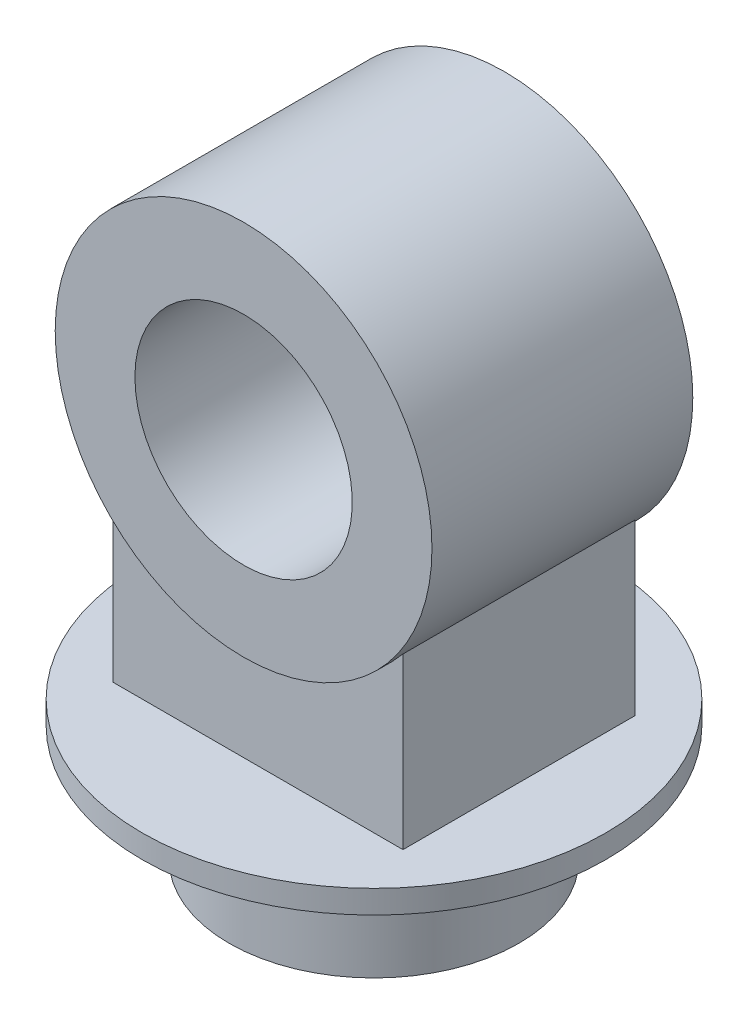
ISO-10303-21;
HEADER;
FILE_DESCRIPTION(('STEP AP214'),'2;1');
FILE_NAME('part.step','',(''),(''),'','','');
FILE_SCHEMA(('AUTOMOTIVE_DESIGN { 1 0 10303 214 1 1 1 1 }'));
ENDSEC;
DATA;
#1=APPLICATION_CONTEXT('core data for automotive mechanical design processes');
#2=APPLICATION_PROTOCOL_DEFINITION('international standard','automotive_design',2000,#1);
#3=PRODUCT_CONTEXT('',#1,'mechanical');
#4=PRODUCT('Part','Part','',(#3));
#5=PRODUCT_RELATED_PRODUCT_CATEGORY('part','',(#4));
#6=PRODUCT_DEFINITION_FORMATION('','',#4);
#7=PRODUCT_DEFINITION_CONTEXT('part definition',#1,'design');
#8=PRODUCT_DEFINITION('design','',#6,#7);
#9=PRODUCT_DEFINITION_SHAPE('','',#8);
#10=(LENGTH_UNIT() NAMED_UNIT(*) SI_UNIT(.MILLI.,.METRE.));
#11=(NAMED_UNIT(*) PLANE_ANGLE_UNIT() SI_UNIT($,.RADIAN.));
#12=(NAMED_UNIT(*) SI_UNIT($,.STERADIAN.) SOLID_ANGLE_UNIT());
#13=UNCERTAINTY_MEASURE_WITH_UNIT(LENGTH_MEASURE(1.E-05),#10,'distance_accuracy_value','');
#14=(GEOMETRIC_REPRESENTATION_CONTEXT(3) GLOBAL_UNCERTAINTY_ASSIGNED_CONTEXT((#13)) GLOBAL_UNIT_ASSIGNED_CONTEXT((#10,
#11,#12)) REPRESENTATION_CONTEXT('',''));
#15=CARTESIAN_POINT('',(0.,0.,0.));
#16=DIRECTION('',(0.,0.,1.));
#17=DIRECTION('',(1.,0.,0.));
#18=AXIS2_PLACEMENT_3D('',#15,#16,#17);
#19=CARTESIAN_POINT('',(0.,80.,0.));
#20=DIRECTION('',(0.,-1.,0.));
#21=DIRECTION('',(0.,0.,-1.));
#22=AXIS2_PLACEMENT_3D('',#19,#20,#21);
#23=CYLINDRICAL_SURFACE('',#22,100.);
#24=CARTESIAN_POINT('',(0.,80.,0.));
#25=DIRECTION('',(0.,1.,0.));
#26=DIRECTION('',(0.,0.,1.));
#27=AXIS2_PLACEMENT_3D('',#24,#25,#26);
#28=CIRCLE('',#27,100.);
#29=CARTESIAN_POINT('',(0.,80.,100.));
#30=VERTEX_POINT('',#29);
#31=EDGE_CURVE('E11',#30,#30,#28,.T.);
#32=ORIENTED_EDGE('',*,*,#31,.F.);
#33=EDGE_LOOP('',(#32));
#34=FACE_BOUND('',#33,.T.);
#35=CARTESIAN_POINT('',(0.,0.,0.));
#36=DIRECTION('',(0.,1.,0.));
#37=DIRECTION('',(0.,0.,1.));
#38=AXIS2_PLACEMENT_3D('',#35,#36,#37);
#39=CIRCLE('',#38,100.);
#40=CARTESIAN_POINT('',(0.,0.,100.));
#41=VERTEX_POINT('',#40);
#42=EDGE_CURVE('E54',#41,#41,#39,.T.);
#43=ORIENTED_EDGE('',*,*,#42,.T.);
#44=EDGE_LOOP('',(#43));
#45=FACE_BOUND('',#44,.T.);
#46=ADVANCED_FACE('F51',(#34,#45),#23,.T.);
#47=CARTESIAN_POINT('',(0.,0.,0.));
#48=DIRECTION('',(0.,1.,0.));
#49=DIRECTION('',(0.,0.,1.));
#50=AXIS2_PLACEMENT_3D('',#47,#48,#49);
#51=PLANE('',#50);
#52=ORIENTED_EDGE('',*,*,#42,.F.);
#53=EDGE_LOOP('',(#52));
#54=FACE_BOUND('',#53,.T.);
#55=ADVANCED_FACE('F169',(#54),#51,.F.);
#56=CARTESIAN_POINT('',(0.,96.,0.));
#57=DIRECTION('',(0.,-1.,0.));
#58=DIRECTION('',(0.,0.,-1.));
#59=AXIS2_PLACEMENT_3D('',#56,#57,#58);
#60=CYLINDRICAL_SURFACE('',#59,160.);
#61=CARTESIAN_POINT('',(0.,96.,0.));
#62=DIRECTION('',(0.,1.,0.));
#63=DIRECTION('',(0.,0.,1.));
#64=AXIS2_PLACEMENT_3D('',#61,#62,#63);
#65=CIRCLE('',#64,160.);
#66=CARTESIAN_POINT('',(0.,96.,160.));
#67=VERTEX_POINT('',#66);
#68=EDGE_CURVE('E125',#67,#67,#65,.T.);
#69=ORIENTED_EDGE('',*,*,#68,.F.);
#70=EDGE_LOOP('',(#69));
#71=FACE_BOUND('',#70,.T.);
#72=CARTESIAN_POINT('',(0.,80.,0.));
#73=DIRECTION('',(0.,1.,0.));
#74=DIRECTION('',(0.,0.,1.));
#75=AXIS2_PLACEMENT_3D('',#72,#73,#74);
#76=CIRCLE('',#75,160.);
#77=CARTESIAN_POINT('',(0.,80.,160.));
#78=VERTEX_POINT('',#77);
#79=EDGE_CURVE('E129',#78,#78,#76,.T.);
#80=ORIENTED_EDGE('',*,*,#79,.T.);
#81=EDGE_LOOP('',(#80));
#82=FACE_BOUND('',#81,.T.);
#83=ADVANCED_FACE('F164',(#71,#82),#60,.T.);
#84=CARTESIAN_POINT('',(0.,96.,0.));
#85=DIRECTION('',(0.,1.,0.));
#86=DIRECTION('',(0.,0.,1.));
#87=AXIS2_PLACEMENT_3D('',#84,#85,#86);
#88=PLANE('',#87);
#89=DIRECTION('',(0.,0.,-1.));
#90=VECTOR('',#89,1.);
#91=CARTESIAN_POINT('',(100.,96.,-80.));
#92=LINE('',#91,#90);
#93=CARTESIAN_POINT('',(100.,96.,80.));
#94=VERTEX_POINT('',#93);
#95=CARTESIAN_POINT('',(100.,96.,-80.));
#96=VERTEX_POINT('',#95);
#97=EDGE_CURVE('E66',#94,#96,#92,.T.);
#98=ORIENTED_EDGE('',*,*,#97,.F.);
#99=DIRECTION('',(1.,0.,0.));
#100=VECTOR('',#99,1.);
#101=CARTESIAN_POINT('',(-100.,96.,80.));
#102=LINE('',#101,#100);
#103=CARTESIAN_POINT('',(-100.,96.,80.));
#104=VERTEX_POINT('',#103);
#105=EDGE_CURVE('E71',#104,#94,#102,.T.);
#106=ORIENTED_EDGE('',*,*,#105,.F.);
#107=DIRECTION('',(0.,0.,1.));
#108=VECTOR('',#107,1.);
#109=CARTESIAN_POINT('',(-100.,96.,-80.));
#110=LINE('',#109,#108);
#111=CARTESIAN_POINT('',(-100.,96.,-80.));
#112=VERTEX_POINT('',#111);
#113=EDGE_CURVE('E137',#112,#104,#110,.T.);
#114=ORIENTED_EDGE('',*,*,#113,.F.);
#115=DIRECTION('',(-1.,0.,0.));
#116=VECTOR('',#115,1.);
#117=CARTESIAN_POINT('',(-100.,96.,-80.));
#118=LINE('',#117,#116);
#119=EDGE_CURVE('E97',#96,#112,#118,.T.);
#120=ORIENTED_EDGE('',*,*,#119,.F.);
#121=EDGE_LOOP('',(#98,#106,#114,#120));
#122=FACE_BOUND('',#121,.T.);
#123=ORIENTED_EDGE('',*,*,#68,.T.);
#124=EDGE_LOOP('',(#123));
#125=FACE_BOUND('',#124,.T.);
#126=ADVANCED_FACE('F160',(#122,#125),#88,.T.);
#127=CARTESIAN_POINT('',(0.,80.,0.));
#128=DIRECTION('',(0.,1.,0.));
#129=DIRECTION('',(0.,0.,1.));
#130=AXIS2_PLACEMENT_3D('',#127,#128,#129);
#131=PLANE('',#130);
#132=ORIENTED_EDGE('',*,*,#31,.T.);
#133=EDGE_LOOP('',(#132));
#134=FACE_BOUND('',#133,.T.);
#135=ORIENTED_EDGE('',*,*,#79,.F.);
#136=EDGE_LOOP('',(#135));
#137=FACE_BOUND('',#136,.T.);
#138=ADVANCED_FACE('F163',(#134,#137),#131,.F.);
#139=CARTESIAN_POINT('',(-100.,426.002,-80.));
#140=DIRECTION('',(0.,0.,1.));
#141=DIRECTION('',(1.,0.,0.));
#142=AXIS2_PLACEMENT_3D('',#139,#140,#141);
#143=PLANE('',#142);
#144=CARTESIAN_POINT('',(0.,296.,-80.));
#145=DIRECTION('',(0.,0.,1.));
#146=DIRECTION('',(1.,0.,0.));
#147=AXIS2_PLACEMENT_3D('',#144,#145,#146);
#148=CIRCLE('',#147,130.);
#149=CARTESIAN_POINT('',(100.,212.933761370819,-80.));
#150=VERTEX_POINT('',#149);
#151=CARTESIAN_POINT('',(-100.,212.933761370819,-80.));
#152=VERTEX_POINT('',#151);
#153=EDGE_CURVE('E109',#150,#152,#148,.F.);
#154=ORIENTED_EDGE('',*,*,#153,.F.);
#155=DIRECTION('',(0.,-1.,0.));
#156=VECTOR('',#155,1.);
#157=CARTESIAN_POINT('',(100.,426.002,-80.));
#158=LINE('',#157,#156);
#159=EDGE_CURVE('E105',#150,#96,#158,.T.);
#160=ORIENTED_EDGE('',*,*,#159,.T.);
#161=ORIENTED_EDGE('',*,*,#119,.T.);
#162=DIRECTION('',(0.,-1.,0.));
#163=VECTOR('',#162,1.);
#164=CARTESIAN_POINT('',(-100.,426.002,-80.));
#165=LINE('',#164,#163);
#166=EDGE_CURVE('E149',#152,#112,#165,.T.);
#167=ORIENTED_EDGE('',*,*,#166,.F.);
#168=EDGE_LOOP('',(#154,#160,#161,#167));
#169=FACE_BOUND('',#168,.T.);
#170=ADVANCED_FACE('F157',(#169),#143,.F.);
#171=CARTESIAN_POINT('',(100.,426.002,-80.));
#172=DIRECTION('',(-1.,0.,0.));
#173=DIRECTION('',(0.,0.,1.));
#174=AXIS2_PLACEMENT_3D('',#171,#172,#173);
#175=PLANE('',#174);
#176=DIRECTION('',(0.,0.,-1.));
#177=VECTOR('',#176,1.);
#178=CARTESIAN_POINT('',(100.,212.933761370819,90.));
#179=LINE('',#178,#177);
#180=CARTESIAN_POINT('',(100.,212.933761370819,80.));
#181=VERTEX_POINT('',#180);
#182=EDGE_CURVE('E102',#181,#150,#179,.T.);
#183=ORIENTED_EDGE('',*,*,#182,.F.);
#184=DIRECTION('',(0.,-1.,0.));
#185=VECTOR('',#184,1.);
#186=CARTESIAN_POINT('',(100.,426.002,80.));
#187=LINE('',#186,#185);
#188=EDGE_CURVE('E89',#181,#94,#187,.T.);
#189=ORIENTED_EDGE('',*,*,#188,.T.);
#190=ORIENTED_EDGE('',*,*,#97,.T.);
#191=ORIENTED_EDGE('',*,*,#159,.F.);
#192=EDGE_LOOP('',(#183,#189,#190,#191));
#193=FACE_BOUND('',#192,.T.);
#194=ADVANCED_FACE('F103',(#193),#175,.F.);
#195=CARTESIAN_POINT('',(-100.,426.002,-80.));
#196=DIRECTION('',(1.,0.,0.));
#197=DIRECTION('',(0.,0.,-1.));
#198=AXIS2_PLACEMENT_3D('',#195,#196,#197);
#199=PLANE('',#198);
#200=DIRECTION('',(0.,0.,-1.));
#201=VECTOR('',#200,1.);
#202=CARTESIAN_POINT('',(-100.,212.933761370819,90.));
#203=LINE('',#202,#201);
#204=CARTESIAN_POINT('',(-100.,212.933761370819,80.));
#205=VERTEX_POINT('',#204);
#206=EDGE_CURVE('E113',#152,#205,#203,.F.);
#207=ORIENTED_EDGE('',*,*,#206,.F.);
#208=ORIENTED_EDGE('',*,*,#166,.T.);
#209=ORIENTED_EDGE('',*,*,#113,.T.);
#210=DIRECTION('',(0.,-1.,0.));
#211=VECTOR('',#210,1.);
#212=CARTESIAN_POINT('',(-100.,426.002,80.));
#213=LINE('',#212,#211);
#214=EDGE_CURVE('E98',#205,#104,#213,.T.);
#215=ORIENTED_EDGE('',*,*,#214,.F.);
#216=EDGE_LOOP('',(#207,#208,#209,#215));
#217=FACE_BOUND('',#216,.T.);
#218=ADVANCED_FACE('F159',(#217),#199,.F.);
#219=CARTESIAN_POINT('',(-100.,426.002,80.));
#220=DIRECTION('',(0.,0.,-1.));
#221=DIRECTION('',(-1.,0.,0.));
#222=AXIS2_PLACEMENT_3D('',#219,#220,#221);
#223=PLANE('',#222);
#224=CARTESIAN_POINT('',(0.,296.,80.));
#225=DIRECTION('',(0.,0.,-1.));
#226=DIRECTION('',(-1.,0.,0.));
#227=AXIS2_PLACEMENT_3D('',#224,#225,#226);
#228=CIRCLE('',#227,130.);
#229=EDGE_CURVE('E93',#205,#181,#228,.F.);
#230=ORIENTED_EDGE('',*,*,#229,.F.);
#231=ORIENTED_EDGE('',*,*,#214,.T.);
#232=ORIENTED_EDGE('',*,*,#105,.T.);
#233=ORIENTED_EDGE('',*,*,#188,.F.);
#234=EDGE_LOOP('',(#230,#231,#232,#233));
#235=FACE_BOUND('',#234,.T.);
#236=ADVANCED_FACE('F91',(#235),#223,.F.);
#237=CARTESIAN_POINT('',(0.,296.,90.));
#238=DIRECTION('',(0.,0.,-1.));
#239=DIRECTION('',(-1.,0.,0.));
#240=AXIS2_PLACEMENT_3D('',#237,#238,#239);
#241=CYLINDRICAL_SURFACE('',#240,130.);
#242=CARTESIAN_POINT('',(0.,296.,90.));
#243=DIRECTION('',(0.,0.,1.));
#244=DIRECTION('',(1.,0.,0.));
#245=AXIS2_PLACEMENT_3D('',#242,#243,#244);
#246=CIRCLE('',#245,130.);
#247=CARTESIAN_POINT('',(130.,296.,90.));
#248=VERTEX_POINT('',#247);
#249=EDGE_CURVE('E115',#248,#248,#246,.T.);
#250=ORIENTED_EDGE('',*,*,#249,.F.);
#251=EDGE_LOOP('',(#250));
#252=FACE_BOUND('',#251,.T.);
#253=CARTESIAN_POINT('',(0.,296.,-90.));
#254=DIRECTION('',(0.,0.,1.));
#255=DIRECTION('',(1.,0.,0.));
#256=AXIS2_PLACEMENT_3D('',#253,#254,#255);
#257=CIRCLE('',#256,130.);
#258=CARTESIAN_POINT('',(130.,296.,-90.));
#259=VERTEX_POINT('',#258);
#260=EDGE_CURVE('E121',#259,#259,#257,.T.);
#261=ORIENTED_EDGE('',*,*,#260,.T.);
#262=EDGE_LOOP('',(#261));
#263=FACE_BOUND('',#262,.T.);
#264=ORIENTED_EDGE('',*,*,#182,.T.);
#265=ORIENTED_EDGE('',*,*,#153,.T.);
#266=ORIENTED_EDGE('',*,*,#206,.T.);
#267=ORIENTED_EDGE('',*,*,#229,.T.);
#268=EDGE_LOOP('',(#264,#265,#266,#267));
#269=FACE_BOUND('',#268,.T.);
#270=ADVANCED_FACE('F112',(#252,#263,#269),#241,.T.);
#271=CARTESIAN_POINT('',(0.,296.,90.));
#272=DIRECTION('',(0.,0.,1.));
#273=DIRECTION('',(1.,0.,0.));
#274=AXIS2_PLACEMENT_3D('',#271,#272,#273);
#275=PLANE('',#274);
#276=ORIENTED_EDGE('',*,*,#249,.T.);
#277=EDGE_LOOP('',(#276));
#278=FACE_BOUND('',#277,.T.);
#279=CARTESIAN_POINT('',(0.,296.,90.));
#280=DIRECTION('',(0.,0.,1.));
#281=DIRECTION('',(1.,0.,0.));
#282=AXIS2_PLACEMENT_3D('',#279,#280,#281);
#283=CIRCLE('',#282,75.);
#284=CARTESIAN_POINT('',(-75.,296.,90.));
#285=VERTEX_POINT('',#284);
#286=EDGE_CURVE('E218',#285,#285,#283,.T.);
#287=ORIENTED_EDGE('',*,*,#286,.F.);
#288=EDGE_LOOP('',(#287));
#289=FACE_BOUND('',#288,.T.);
#290=ADVANCED_FACE('F201',(#278,#289),#275,.T.);
#291=CARTESIAN_POINT('',(0.,296.,-90.));
#292=DIRECTION('',(0.,0.,1.));
#293=DIRECTION('',(1.,0.,0.));
#294=AXIS2_PLACEMENT_3D('',#291,#292,#293);
#295=PLANE('',#294);
#296=ORIENTED_EDGE('',*,*,#260,.F.);
#297=EDGE_LOOP('',(#296));
#298=FACE_BOUND('',#297,.T.);
#299=CARTESIAN_POINT('',(0.,296.,-90.));
#300=DIRECTION('',(0.,0.,1.));
#301=DIRECTION('',(1.,0.,0.));
#302=AXIS2_PLACEMENT_3D('',#299,#300,#301);
#303=CIRCLE('',#302,75.);
#304=CARTESIAN_POINT('',(-75.,296.,-90.));
#305=VERTEX_POINT('',#304);
#306=EDGE_CURVE('E221',#305,#305,#303,.T.);
#307=ORIENTED_EDGE('',*,*,#306,.T.);
#308=EDGE_LOOP('',(#307));
#309=FACE_BOUND('',#308,.T.);
#310=ADVANCED_FACE('F203',(#298,#309),#295,.F.);
#311=CARTESIAN_POINT('',(0.,296.,90.));
#312=DIRECTION('',(0.,0.,-1.));
#313=DIRECTION('',(-1.,0.,0.));
#314=AXIS2_PLACEMENT_3D('',#311,#312,#313);
#315=CYLINDRICAL_SURFACE('',#314,75.);
#316=CARTESIAN_POINT('',(-75.,296.,90.));
#317=CARTESIAN_POINT('',(-75.,296.,88.125));
#318=CARTESIAN_POINT('',(-75.,296.,86.25));
#319=CARTESIAN_POINT('',(-75.,296.,82.5));
#320=CARTESIAN_POINT('',(-75.,296.,80.625));
#321=CARTESIAN_POINT('',(-75.,296.,76.875));
#322=CARTESIAN_POINT('',(-75.,296.,75.));
#323=CARTESIAN_POINT('',(-75.,296.,71.25));
#324=CARTESIAN_POINT('',(-75.,296.,69.375));
#325=CARTESIAN_POINT('',(-75.,296.,65.625));
#326=CARTESIAN_POINT('',(-75.,296.,63.75));
#327=CARTESIAN_POINT('',(-75.,296.,60.));
#328=CARTESIAN_POINT('',(-75.,296.,58.125));
#329=CARTESIAN_POINT('',(-75.,296.,54.375));
#330=CARTESIAN_POINT('',(-75.,296.,52.5));
#331=CARTESIAN_POINT('',(-75.,296.,48.75));
#332=CARTESIAN_POINT('',(-75.,296.,46.875));
#333=CARTESIAN_POINT('',(-75.,296.,43.125));
#334=CARTESIAN_POINT('',(-75.,296.,41.25));
#335=CARTESIAN_POINT('',(-75.,296.,37.5));
#336=CARTESIAN_POINT('',(-75.,296.,35.625));
#337=CARTESIAN_POINT('',(-75.,296.,31.875));
#338=CARTESIAN_POINT('',(-75.,296.,30.));
#339=CARTESIAN_POINT('',(-75.,296.,26.25));
#340=CARTESIAN_POINT('',(-75.,296.,24.375));
#341=CARTESIAN_POINT('',(-75.,296.,20.625));
#342=CARTESIAN_POINT('',(-75.,296.,18.75));
#343=CARTESIAN_POINT('',(-75.,296.,15.));
#344=CARTESIAN_POINT('',(-75.,296.,13.125));
#345=CARTESIAN_POINT('',(-75.,296.,9.37499999999998));
#346=CARTESIAN_POINT('',(-75.,296.,7.49999999999998));
#347=CARTESIAN_POINT('',(-75.,296.,3.74999999999998));
#348=CARTESIAN_POINT('',(-75.,296.,1.87499999999997));
#349=CARTESIAN_POINT('',(-75.,296.,-1.87500000000003));
#350=CARTESIAN_POINT('',(-75.,296.,-3.75000000000003));
#351=CARTESIAN_POINT('',(-75.,296.,-7.50000000000003));
#352=CARTESIAN_POINT('',(-75.,296.,-9.37500000000004));
#353=CARTESIAN_POINT('',(-75.,296.,-13.125));
#354=CARTESIAN_POINT('',(-75.,296.,-15.));
#355=CARTESIAN_POINT('',(-75.,296.,-18.75));
#356=CARTESIAN_POINT('',(-75.,296.,-20.625));
#357=CARTESIAN_POINT('',(-75.,296.,-24.375));
#358=CARTESIAN_POINT('',(-75.,296.,-26.25));
#359=CARTESIAN_POINT('',(-75.,296.,-30.));
#360=CARTESIAN_POINT('',(-75.,296.,-31.875));
#361=CARTESIAN_POINT('',(-75.,296.,-35.625));
#362=CARTESIAN_POINT('',(-75.,296.,-37.5));
#363=CARTESIAN_POINT('',(-75.,296.,-41.25));
#364=CARTESIAN_POINT('',(-75.,296.,-43.125));
#365=CARTESIAN_POINT('',(-75.,296.,-46.875));
#366=CARTESIAN_POINT('',(-75.,296.,-48.75));
#367=CARTESIAN_POINT('',(-75.,296.,-52.5));
#368=CARTESIAN_POINT('',(-75.,296.,-54.375));
#369=CARTESIAN_POINT('',(-75.,296.,-58.125));
#370=CARTESIAN_POINT('',(-75.,296.,-60.));
#371=CARTESIAN_POINT('',(-75.,296.,-63.75));
#372=CARTESIAN_POINT('',(-75.,296.,-65.625));
#373=CARTESIAN_POINT('',(-75.,296.,-69.375));
#374=CARTESIAN_POINT('',(-75.,296.,-71.25));
#375=CARTESIAN_POINT('',(-75.,296.,-75.));
#376=CARTESIAN_POINT('',(-75.,296.,-76.875));
#377=CARTESIAN_POINT('',(-75.,296.,-80.625));
#378=CARTESIAN_POINT('',(-75.,296.,-82.5));
#379=CARTESIAN_POINT('',(-75.,296.,-86.25));
#380=CARTESIAN_POINT('',(-75.,296.,-88.125));
#381=CARTESIAN_POINT('',(-75.,296.,-90.));
#382=B_SPLINE_CURVE_WITH_KNOTS('',3,(#316,#317,#318,#319,#320,#321,#322,#323,#324,#325,#326,
#327,#328,#329,#330,#331,#332,#333,#334,#335,#336,#337,#338,#339,#340,#341,#342,#343,#344,#345,
#346,#347,#348,#349,#350,#351,#352,#353,#354,#355,#356,#357,#358,#359,#360,#361,#362,#363,#364,
#365,#366,#367,#368,#369,#370,#371,#372,#373,#374,#375,#376,#377,#378,#379,#380,#381),
.UNSPECIFIED.,.F.,.F.,(4,2,2,2,2,2,2,2,2,2,2,2,2,2,2,2,2,2,2,2,2,2,2,2,2,2,2,2,2,2,2,2,4),(0.,
5.62499999999999,11.25,16.875,22.5,28.125,33.75,39.375,45.,50.625,56.25,61.875,67.5,73.125,
78.75,84.375,90.,95.625,101.25,106.875,112.5,118.125,123.75,129.375,135.,140.625,146.25,151.875,
157.5,163.125,168.75,174.375,180.),.UNSPECIFIED.);
#383=EDGE_CURVE('BSEAM206',#285,#305,#382,.T.);
#384=ORIENTED_EDGE('',*,*,#286,.T.);
#385=ORIENTED_EDGE('',*,*,#306,.F.);
#386=ORIENTED_EDGE('',*,*,#383,.T.);
#387=ORIENTED_EDGE('',*,*,#383,.F.);
#388=EDGE_LOOP('',(#384,#386,#385,#387));
#389=FACE_BOUND('',#388,.T.);
#390=ADVANCED_FACE('F206',(#389),#315,.F.);
#391=CLOSED_SHELL('',(#46,#55,#83,#126,#138,#170,#194,#218,#236,#270,#290,#310,#390));
#392=MANIFOLD_SOLID_BREP('B2',#391);
#393=ADVANCED_BREP_SHAPE_REPRESENTATION('',(#18,#392),#14);
#394=SHAPE_DEFINITION_REPRESENTATION(#9,#393);
ENDSEC;
END-ISO-10303-21;
